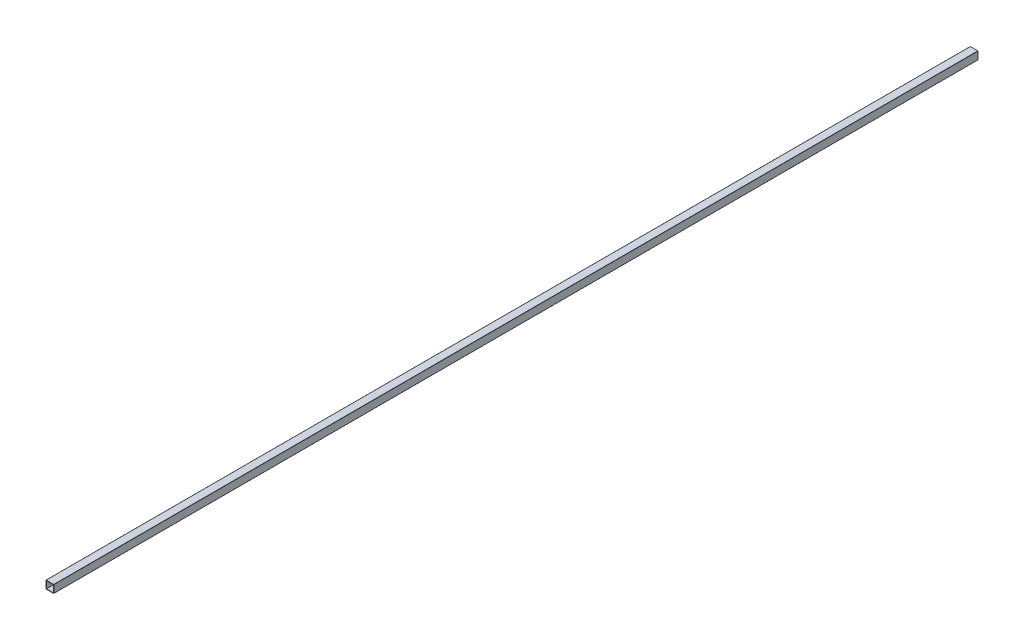
ISO-10303-21;
HEADER;
FILE_DESCRIPTION(('STEP AP214'),'2;1');
FILE_NAME('part.step','',(''),(''),'','','');
FILE_SCHEMA(('AUTOMOTIVE_DESIGN { 1 0 10303 214 1 1 1 1 }'));
ENDSEC;
DATA;
#1=APPLICATION_CONTEXT('core data for automotive mechanical design processes');
#2=APPLICATION_PROTOCOL_DEFINITION('international standard','automotive_design',2000,#1);
#3=PRODUCT_CONTEXT('',#1,'mechanical');
#4=PRODUCT('Part','Part','',(#3));
#5=PRODUCT_RELATED_PRODUCT_CATEGORY('part','',(#4));
#6=PRODUCT_DEFINITION_FORMATION('','',#4);
#7=PRODUCT_DEFINITION_CONTEXT('part definition',#1,'design');
#8=PRODUCT_DEFINITION('design','',#6,#7);
#9=PRODUCT_DEFINITION_SHAPE('','',#8);
#10=(LENGTH_UNIT() NAMED_UNIT(*) SI_UNIT(.MILLI.,.METRE.));
#11=(NAMED_UNIT(*) PLANE_ANGLE_UNIT() SI_UNIT($,.RADIAN.));
#12=(NAMED_UNIT(*) SI_UNIT($,.STERADIAN.) SOLID_ANGLE_UNIT());
#13=UNCERTAINTY_MEASURE_WITH_UNIT(LENGTH_MEASURE(1.E-05),#10,'distance_accuracy_value','');
#14=(GEOMETRIC_REPRESENTATION_CONTEXT(3) GLOBAL_UNCERTAINTY_ASSIGNED_CONTEXT((#13)) GLOBAL_UNIT_ASSIGNED_CONTEXT((#10,
#11,#12)) REPRESENTATION_CONTEXT('',''));
#15=CARTESIAN_POINT('',(0.,0.,0.));
#16=DIRECTION('',(0.,0.,1.));
#17=DIRECTION('',(1.,0.,0.));
#18=AXIS2_PLACEMENT_3D('',#15,#16,#17);
#19=CARTESIAN_POINT('',(24.4,24.4,6000.));
#20=DIRECTION('',(0.,0.,-1.));
#21=DIRECTION('',(-1.,0.,0.));
#22=AXIS2_PLACEMENT_3D('',#19,#20,#21);
#23=PLANE('',#22);
#24=CARTESIAN_POINT('',(24.4,24.4,6000.));
#25=DIRECTION('',(0.,0.,1.));
#26=DIRECTION('',(-1.,0.,0.));
#27=AXIS2_PLACEMENT_3D('',#24,#25,#26);
#28=CIRCLE('',#27,1.);
#29=CARTESIAN_POINT('',(25.4,24.4,6000.));
#30=VERTEX_POINT('',#29);
#31=CARTESIAN_POINT('',(24.4,25.4,6000.));
#32=VERTEX_POINT('',#31);
#33=EDGE_CURVE('E158',#30,#32,#28,.T.);
#34=ORIENTED_EDGE('',*,*,#33,.T.);
#35=DIRECTION('',(-1.,0.,0.));
#36=VECTOR('',#35,1.);
#37=CARTESIAN_POINT('',(-24.4,25.4,6000.));
#38=LINE('',#37,#36);
#39=CARTESIAN_POINT('',(-24.4,25.4,6000.));
#40=VERTEX_POINT('',#39);
#41=EDGE_CURVE('E161',#32,#40,#38,.T.);
#42=ORIENTED_EDGE('',*,*,#41,.T.);
#43=CARTESIAN_POINT('',(-24.4,24.4,6000.));
#44=DIRECTION('',(0.,0.,1.));
#45=DIRECTION('',(-1.,0.,0.));
#46=AXIS2_PLACEMENT_3D('',#43,#44,#45);
#47=CIRCLE('',#46,1.);
#48=CARTESIAN_POINT('',(-25.4,24.4,6000.));
#49=VERTEX_POINT('',#48);
#50=EDGE_CURVE('E164',#40,#49,#47,.T.);
#51=ORIENTED_EDGE('',*,*,#50,.T.);
#52=DIRECTION('',(0.,-1.,0.));
#53=VECTOR('',#52,1.);
#54=CARTESIAN_POINT('',(-25.4,-24.4,6000.));
#55=LINE('',#54,#53);
#56=CARTESIAN_POINT('',(-25.4,-24.4,6000.));
#57=VERTEX_POINT('',#56);
#58=EDGE_CURVE('E166',#49,#57,#55,.T.);
#59=ORIENTED_EDGE('',*,*,#58,.T.);
#60=CARTESIAN_POINT('',(-24.4,-24.4,6000.));
#61=DIRECTION('',(0.,0.,1.));
#62=DIRECTION('',(-1.,0.,0.));
#63=AXIS2_PLACEMENT_3D('',#60,#61,#62);
#64=CIRCLE('',#63,1.);
#65=CARTESIAN_POINT('',(-24.4,-25.4,6000.));
#66=VERTEX_POINT('',#65);
#67=EDGE_CURVE('E168',#57,#66,#64,.T.);
#68=ORIENTED_EDGE('',*,*,#67,.T.);
#69=DIRECTION('',(1.,0.,0.));
#70=VECTOR('',#69,1.);
#71=CARTESIAN_POINT('',(-24.4,-25.4,6000.));
#72=LINE('',#71,#70);
#73=CARTESIAN_POINT('',(24.4,-25.4,6000.));
#74=VERTEX_POINT('',#73);
#75=EDGE_CURVE('E170',#66,#74,#72,.T.);
#76=ORIENTED_EDGE('',*,*,#75,.T.);
#77=CARTESIAN_POINT('',(24.4,-24.4,6000.));
#78=DIRECTION('',(0.,0.,1.));
#79=DIRECTION('',(1.,0.,0.));
#80=AXIS2_PLACEMENT_3D('',#77,#78,#79);
#81=CIRCLE('',#80,1.);
#82=CARTESIAN_POINT('',(25.4,-24.4,6000.));
#83=VERTEX_POINT('',#82);
#84=EDGE_CURVE('E172',#74,#83,#81,.T.);
#85=ORIENTED_EDGE('',*,*,#84,.T.);
#86=DIRECTION('',(0.,1.,0.));
#87=VECTOR('',#86,1.);
#88=CARTESIAN_POINT('',(25.4,-24.4,6000.));
#89=LINE('',#88,#87);
#90=EDGE_CURVE('E174',#83,#30,#89,.T.);
#91=ORIENTED_EDGE('',*,*,#90,.T.);
#92=EDGE_LOOP('',(#34,#42,#51,#59,#68,#76,#85,#91));
#93=FACE_BOUND('',#92,.T.);
#94=DIRECTION('',(1.,0.,0.));
#95=VECTOR('',#94,1.);
#96=CARTESIAN_POINT('',(-22.74,-22.74,6000.));
#97=LINE('',#96,#95);
#98=CARTESIAN_POINT('',(-22.74,-22.74,6000.));
#99=VERTEX_POINT('',#98);
#100=CARTESIAN_POINT('',(22.74,-22.74,6000.));
#101=VERTEX_POINT('',#100);
#102=EDGE_CURVE('E122',#99,#101,#97,.T.);
#103=ORIENTED_EDGE('',*,*,#102,.F.);
#104=DIRECTION('',(0.,-1.,0.));
#105=VECTOR('',#104,1.);
#106=CARTESIAN_POINT('',(-22.74,-22.74,6000.));
#107=LINE('',#106,#105);
#108=CARTESIAN_POINT('',(-22.74,22.74,6000.));
#109=VERTEX_POINT('',#108);
#110=EDGE_CURVE('E144',#109,#99,#107,.T.);
#111=ORIENTED_EDGE('',*,*,#110,.F.);
#112=DIRECTION('',(-1.,0.,0.));
#113=VECTOR('',#112,1.);
#114=CARTESIAN_POINT('',(-22.74,22.74,6000.));
#115=LINE('',#114,#113);
#116=CARTESIAN_POINT('',(22.74,22.74,6000.));
#117=VERTEX_POINT('',#116);
#118=EDGE_CURVE('E142',#117,#109,#115,.T.);
#119=ORIENTED_EDGE('',*,*,#118,.F.);
#120=DIRECTION('',(0.,1.,0.));
#121=VECTOR('',#120,1.);
#122=CARTESIAN_POINT('',(22.74,-22.74,6000.));
#123=LINE('',#122,#121);
#124=EDGE_CURVE('E130',#101,#117,#123,.T.);
#125=ORIENTED_EDGE('',*,*,#124,.F.);
#126=EDGE_LOOP('',(#103,#111,#119,#125));
#127=FACE_BOUND('',#126,.T.);
#128=ADVANCED_FACE('F33',(#93,#127),#23,.F.);
#129=CARTESIAN_POINT('',(24.4,24.4,0.));
#130=DIRECTION('',(0.,0.,-1.));
#131=DIRECTION('',(-1.,0.,0.));
#132=AXIS2_PLACEMENT_3D('',#129,#130,#131);
#133=PLANE('',#132);
#134=CARTESIAN_POINT('',(24.4,24.4,0.));
#135=DIRECTION('',(0.,0.,1.));
#136=DIRECTION('',(-1.,0.,0.));
#137=AXIS2_PLACEMENT_3D('',#134,#135,#136);
#138=CIRCLE('',#137,1.);
#139=CARTESIAN_POINT('',(25.4,24.4,0.));
#140=VERTEX_POINT('',#139);
#141=CARTESIAN_POINT('',(24.4,25.4,0.));
#142=VERTEX_POINT('',#141);
#143=EDGE_CURVE('E138',#140,#142,#138,.T.);
#144=ORIENTED_EDGE('',*,*,#143,.F.);
#145=DIRECTION('',(0.,1.,0.));
#146=VECTOR('',#145,1.);
#147=CARTESIAN_POINT('',(25.4,-24.4,0.));
#148=LINE('',#147,#146);
#149=CARTESIAN_POINT('',(25.4,-24.4,0.));
#150=VERTEX_POINT('',#149);
#151=EDGE_CURVE('E162',#150,#140,#148,.T.);
#152=ORIENTED_EDGE('',*,*,#151,.F.);
#153=CARTESIAN_POINT('',(24.4,-24.4,0.));
#154=DIRECTION('',(0.,0.,1.));
#155=DIRECTION('',(1.,0.,0.));
#156=AXIS2_PLACEMENT_3D('',#153,#154,#155);
#157=CIRCLE('',#156,1.);
#158=CARTESIAN_POINT('',(24.4,-25.4,0.));
#159=VERTEX_POINT('',#158);
#160=EDGE_CURVE('E189',#159,#150,#157,.T.);
#161=ORIENTED_EDGE('',*,*,#160,.F.);
#162=DIRECTION('',(1.,0.,0.));
#163=VECTOR('',#162,1.);
#164=CARTESIAN_POINT('',(-24.4,-25.4,0.));
#165=LINE('',#164,#163);
#166=CARTESIAN_POINT('',(-24.4,-25.4,0.));
#167=VERTEX_POINT('',#166);
#168=EDGE_CURVE('E187',#167,#159,#165,.T.);
#169=ORIENTED_EDGE('',*,*,#168,.F.);
#170=CARTESIAN_POINT('',(-24.4,-24.4,0.));
#171=DIRECTION('',(0.,0.,1.));
#172=DIRECTION('',(-1.,0.,0.));
#173=AXIS2_PLACEMENT_3D('',#170,#171,#172);
#174=CIRCLE('',#173,1.);
#175=CARTESIAN_POINT('',(-25.4,-24.4,0.));
#176=VERTEX_POINT('',#175);
#177=EDGE_CURVE('E185',#176,#167,#174,.T.);
#178=ORIENTED_EDGE('',*,*,#177,.F.);
#179=DIRECTION('',(0.,-1.,0.));
#180=VECTOR('',#179,1.);
#181=CARTESIAN_POINT('',(-25.4,-24.4,0.));
#182=LINE('',#181,#180);
#183=CARTESIAN_POINT('',(-25.4,24.4,0.));
#184=VERTEX_POINT('',#183);
#185=EDGE_CURVE('E183',#184,#176,#182,.T.);
#186=ORIENTED_EDGE('',*,*,#185,.F.);
#187=CARTESIAN_POINT('',(-24.4,24.4,0.));
#188=DIRECTION('',(0.,0.,1.));
#189=DIRECTION('',(-1.,0.,0.));
#190=AXIS2_PLACEMENT_3D('',#187,#188,#189);
#191=CIRCLE('',#190,1.);
#192=CARTESIAN_POINT('',(-24.4,25.4,0.));
#193=VERTEX_POINT('',#192);
#194=EDGE_CURVE('E181',#193,#184,#191,.T.);
#195=ORIENTED_EDGE('',*,*,#194,.F.);
#196=DIRECTION('',(-1.,0.,0.));
#197=VECTOR('',#196,1.);
#198=CARTESIAN_POINT('',(-24.4,25.4,0.));
#199=LINE('',#198,#197);
#200=EDGE_CURVE('E179',#142,#193,#199,.T.);
#201=ORIENTED_EDGE('',*,*,#200,.F.);
#202=EDGE_LOOP('',(#144,#152,#161,#169,#178,#186,#195,#201));
#203=FACE_BOUND('',#202,.T.);
#204=DIRECTION('',(0.,-1.,0.));
#205=VECTOR('',#204,1.);
#206=CARTESIAN_POINT('',(-22.74,-22.74,0.));
#207=LINE('',#206,#205);
#208=CARTESIAN_POINT('',(-22.74,22.74,0.));
#209=VERTEX_POINT('',#208);
#210=CARTESIAN_POINT('',(-22.74,-22.74,0.));
#211=VERTEX_POINT('',#210);
#212=EDGE_CURVE('E131',#209,#211,#207,.T.);
#213=ORIENTED_EDGE('',*,*,#212,.T.);
#214=DIRECTION('',(1.,0.,0.));
#215=VECTOR('',#214,1.);
#216=CARTESIAN_POINT('',(-22.74,-22.74,0.));
#217=LINE('',#216,#215);
#218=CARTESIAN_POINT('',(22.74,-22.74,0.));
#219=VERTEX_POINT('',#218);
#220=EDGE_CURVE('E56',#211,#219,#217,.T.);
#221=ORIENTED_EDGE('',*,*,#220,.T.);
#222=DIRECTION('',(0.,1.,0.));
#223=VECTOR('',#222,1.);
#224=CARTESIAN_POINT('',(22.74,-22.74,0.));
#225=LINE('',#224,#223);
#226=CARTESIAN_POINT('',(22.74,22.74,0.));
#227=VERTEX_POINT('',#226);
#228=EDGE_CURVE('E137',#219,#227,#225,.T.);
#229=ORIENTED_EDGE('',*,*,#228,.T.);
#230=DIRECTION('',(-1.,0.,0.));
#231=VECTOR('',#230,1.);
#232=CARTESIAN_POINT('',(-22.74,22.74,0.));
#233=LINE('',#232,#231);
#234=EDGE_CURVE('E150',#227,#209,#233,.T.);
#235=ORIENTED_EDGE('',*,*,#234,.T.);
#236=EDGE_LOOP('',(#213,#221,#229,#235));
#237=FACE_BOUND('',#236,.T.);
#238=ADVANCED_FACE('F219',(#203,#237),#133,.T.);
#239=CARTESIAN_POINT('',(24.4,24.4,6000.));
#240=DIRECTION('',(0.,0.,-1.));
#241=DIRECTION('',(-1.,0.,0.));
#242=AXIS2_PLACEMENT_3D('',#239,#240,#241);
#243=CYLINDRICAL_SURFACE('',#242,1.);
#244=ORIENTED_EDGE('',*,*,#143,.T.);
#245=DIRECTION('',(0.,0.,-1.));
#246=VECTOR('',#245,1.);
#247=CARTESIAN_POINT('',(24.4,25.4,6000.));
#248=LINE('',#247,#246);
#249=EDGE_CURVE('E11',#32,#142,#248,.T.);
#250=ORIENTED_EDGE('',*,*,#249,.F.);
#251=ORIENTED_EDGE('',*,*,#33,.F.);
#252=DIRECTION('',(0.,0.,-1.));
#253=VECTOR('',#252,1.);
#254=CARTESIAN_POINT('',(25.4,24.4,6000.));
#255=LINE('',#254,#253);
#256=EDGE_CURVE('E176',#30,#140,#255,.T.);
#257=ORIENTED_EDGE('',*,*,#256,.T.);
#258=EDGE_LOOP('',(#244,#250,#251,#257));
#259=FACE_BOUND('',#258,.T.);
#260=ADVANCED_FACE('F35',(#259),#243,.T.);
#261=CARTESIAN_POINT('',(-24.4,25.4,6000.));
#262=DIRECTION('',(0.,-1.,0.));
#263=DIRECTION('',(0.,0.,-1.));
#264=AXIS2_PLACEMENT_3D('',#261,#262,#263);
#265=PLANE('',#264);
#266=ORIENTED_EDGE('',*,*,#200,.T.);
#267=DIRECTION('',(0.,0.,-1.));
#268=VECTOR('',#267,1.);
#269=CARTESIAN_POINT('',(-24.4,25.4,6000.));
#270=LINE('',#269,#268);
#271=EDGE_CURVE('E41',#40,#193,#270,.T.);
#272=ORIENTED_EDGE('',*,*,#271,.F.);
#273=ORIENTED_EDGE('',*,*,#41,.F.);
#274=ORIENTED_EDGE('',*,*,#249,.T.);
#275=EDGE_LOOP('',(#266,#272,#273,#274));
#276=FACE_BOUND('',#275,.T.);
#277=ADVANCED_FACE('F236',(#276),#265,.F.);
#278=CARTESIAN_POINT('',(-24.4,24.4,6000.));
#279=DIRECTION('',(0.,0.,-1.));
#280=DIRECTION('',(-1.,0.,0.));
#281=AXIS2_PLACEMENT_3D('',#278,#279,#280);
#282=CYLINDRICAL_SURFACE('',#281,1.);
#283=ORIENTED_EDGE('',*,*,#194,.T.);
#284=DIRECTION('',(0.,0.,-1.));
#285=VECTOR('',#284,1.);
#286=CARTESIAN_POINT('',(-25.4,24.4,6000.));
#287=LINE('',#286,#285);
#288=EDGE_CURVE('E206',#49,#184,#287,.T.);
#289=ORIENTED_EDGE('',*,*,#288,.F.);
#290=ORIENTED_EDGE('',*,*,#50,.F.);
#291=ORIENTED_EDGE('',*,*,#271,.T.);
#292=EDGE_LOOP('',(#283,#289,#290,#291));
#293=FACE_BOUND('',#292,.T.);
#294=ADVANCED_FACE('F213',(#293),#282,.T.);
#295=CARTESIAN_POINT('',(-25.4,-24.4,6000.));
#296=DIRECTION('',(1.,0.,0.));
#297=DIRECTION('',(0.,0.,-1.));
#298=AXIS2_PLACEMENT_3D('',#295,#296,#297);
#299=PLANE('',#298);
#300=ORIENTED_EDGE('',*,*,#185,.T.);
#301=DIRECTION('',(0.,0.,-1.));
#302=VECTOR('',#301,1.);
#303=CARTESIAN_POINT('',(-25.4,-24.4,6000.));
#304=LINE('',#303,#302);
#305=EDGE_CURVE('E203',#57,#176,#304,.T.);
#306=ORIENTED_EDGE('',*,*,#305,.F.);
#307=ORIENTED_EDGE('',*,*,#58,.F.);
#308=ORIENTED_EDGE('',*,*,#288,.T.);
#309=EDGE_LOOP('',(#300,#306,#307,#308));
#310=FACE_BOUND('',#309,.T.);
#311=ADVANCED_FACE('F225',(#310),#299,.F.);
#312=CARTESIAN_POINT('',(-24.4,-24.4,6000.));
#313=DIRECTION('',(0.,0.,-1.));
#314=DIRECTION('',(-1.,0.,0.));
#315=AXIS2_PLACEMENT_3D('',#312,#313,#314);
#316=CYLINDRICAL_SURFACE('',#315,1.);
#317=ORIENTED_EDGE('',*,*,#177,.T.);
#318=DIRECTION('',(0.,0.,-1.));
#319=VECTOR('',#318,1.);
#320=CARTESIAN_POINT('',(-24.4,-25.4,6000.));
#321=LINE('',#320,#319);
#322=EDGE_CURVE('E200',#66,#167,#321,.T.);
#323=ORIENTED_EDGE('',*,*,#322,.F.);
#324=ORIENTED_EDGE('',*,*,#67,.F.);
#325=ORIENTED_EDGE('',*,*,#305,.T.);
#326=EDGE_LOOP('',(#317,#323,#324,#325));
#327=FACE_BOUND('',#326,.T.);
#328=ADVANCED_FACE('F229',(#327),#316,.T.);
#329=CARTESIAN_POINT('',(-24.4,-25.4,6000.));
#330=DIRECTION('',(0.,1.,0.));
#331=DIRECTION('',(0.,0.,1.));
#332=AXIS2_PLACEMENT_3D('',#329,#330,#331);
#333=PLANE('',#332);
#334=ORIENTED_EDGE('',*,*,#168,.T.);
#335=DIRECTION('',(0.,0.,-1.));
#336=VECTOR('',#335,1.);
#337=CARTESIAN_POINT('',(24.4,-25.4,6000.));
#338=LINE('',#337,#336);
#339=EDGE_CURVE('E197',#74,#159,#338,.T.);
#340=ORIENTED_EDGE('',*,*,#339,.F.);
#341=ORIENTED_EDGE('',*,*,#75,.F.);
#342=ORIENTED_EDGE('',*,*,#322,.T.);
#343=EDGE_LOOP('',(#334,#340,#341,#342));
#344=FACE_BOUND('',#343,.T.);
#345=ADVANCED_FACE('F249',(#344),#333,.F.);
#346=CARTESIAN_POINT('',(24.4,-24.4,6000.));
#347=DIRECTION('',(0.,0.,-1.));
#348=DIRECTION('',(-1.,0.,0.));
#349=AXIS2_PLACEMENT_3D('',#346,#347,#348);
#350=CYLINDRICAL_SURFACE('',#349,1.);
#351=ORIENTED_EDGE('',*,*,#160,.T.);
#352=DIRECTION('',(0.,0.,-1.));
#353=VECTOR('',#352,1.);
#354=CARTESIAN_POINT('',(25.4,-24.4,6000.));
#355=LINE('',#354,#353);
#356=EDGE_CURVE('E194',#83,#150,#355,.T.);
#357=ORIENTED_EDGE('',*,*,#356,.F.);
#358=ORIENTED_EDGE('',*,*,#84,.F.);
#359=ORIENTED_EDGE('',*,*,#339,.T.);
#360=EDGE_LOOP('',(#351,#357,#358,#359));
#361=FACE_BOUND('',#360,.T.);
#362=ADVANCED_FACE('F247',(#361),#350,.T.);
#363=CARTESIAN_POINT('',(25.4,-24.4,6000.));
#364=DIRECTION('',(-1.,0.,0.));
#365=DIRECTION('',(0.,0.,1.));
#366=AXIS2_PLACEMENT_3D('',#363,#364,#365);
#367=PLANE('',#366);
#368=ORIENTED_EDGE('',*,*,#151,.T.);
#369=ORIENTED_EDGE('',*,*,#256,.F.);
#370=ORIENTED_EDGE('',*,*,#90,.F.);
#371=ORIENTED_EDGE('',*,*,#356,.T.);
#372=EDGE_LOOP('',(#368,#369,#370,#371));
#373=FACE_BOUND('',#372,.T.);
#374=ADVANCED_FACE('F242',(#373),#367,.F.);
#375=CARTESIAN_POINT('',(-22.74,-22.74,6000.));
#376=DIRECTION('',(0.,1.,0.));
#377=DIRECTION('',(0.,0.,1.));
#378=AXIS2_PLACEMENT_3D('',#375,#376,#377);
#379=PLANE('',#378);
#380=ORIENTED_EDGE('',*,*,#220,.F.);
#381=DIRECTION('',(0.,0.,-1.));
#382=VECTOR('',#381,1.);
#383=CARTESIAN_POINT('',(-22.74,-22.74,6000.));
#384=LINE('',#383,#382);
#385=EDGE_CURVE('E126',#99,#211,#384,.T.);
#386=ORIENTED_EDGE('',*,*,#385,.F.);
#387=ORIENTED_EDGE('',*,*,#102,.T.);
#388=DIRECTION('',(0.,0.,-1.));
#389=VECTOR('',#388,1.);
#390=CARTESIAN_POINT('',(22.74,-22.74,6000.));
#391=LINE('',#390,#389);
#392=EDGE_CURVE('E125',#101,#219,#391,.T.);
#393=ORIENTED_EDGE('',*,*,#392,.T.);
#394=EDGE_LOOP('',(#380,#386,#387,#393));
#395=FACE_BOUND('',#394,.T.);
#396=ADVANCED_FACE('F124',(#395),#379,.T.);
#397=CARTESIAN_POINT('',(22.74,-22.74,6000.));
#398=DIRECTION('',(-1.,0.,0.));
#399=DIRECTION('',(0.,-1.,0.));
#400=AXIS2_PLACEMENT_3D('',#397,#398,#399);
#401=PLANE('',#400);
#402=ORIENTED_EDGE('',*,*,#228,.F.);
#403=ORIENTED_EDGE('',*,*,#392,.F.);
#404=ORIENTED_EDGE('',*,*,#124,.T.);
#405=DIRECTION('',(0.,0.,-1.));
#406=VECTOR('',#405,1.);
#407=CARTESIAN_POINT('',(22.74,22.74,6000.));
#408=LINE('',#407,#406);
#409=EDGE_CURVE('E139',#117,#227,#408,.T.);
#410=ORIENTED_EDGE('',*,*,#409,.T.);
#411=EDGE_LOOP('',(#402,#403,#404,#410));
#412=FACE_BOUND('',#411,.T.);
#413=ADVANCED_FACE('F134',(#412),#401,.T.);
#414=CARTESIAN_POINT('',(-22.74,22.74,6000.));
#415=DIRECTION('',(0.,-1.,0.));
#416=DIRECTION('',(1.,0.,0.));
#417=AXIS2_PLACEMENT_3D('',#414,#415,#416);
#418=PLANE('',#417);
#419=ORIENTED_EDGE('',*,*,#234,.F.);
#420=ORIENTED_EDGE('',*,*,#409,.F.);
#421=ORIENTED_EDGE('',*,*,#118,.T.);
#422=DIRECTION('',(0.,0.,-1.));
#423=VECTOR('',#422,1.);
#424=CARTESIAN_POINT('',(-22.74,22.74,6000.));
#425=LINE('',#424,#423);
#426=EDGE_CURVE('E48',#109,#209,#425,.T.);
#427=ORIENTED_EDGE('',*,*,#426,.T.);
#428=EDGE_LOOP('',(#419,#420,#421,#427));
#429=FACE_BOUND('',#428,.T.);
#430=ADVANCED_FACE('F274',(#429),#418,.T.);
#431=CARTESIAN_POINT('',(-22.74,-22.74,6000.));
#432=DIRECTION('',(1.,0.,0.));
#433=DIRECTION('',(0.,0.,-1.));
#434=AXIS2_PLACEMENT_3D('',#431,#432,#433);
#435=PLANE('',#434);
#436=ORIENTED_EDGE('',*,*,#212,.F.);
#437=ORIENTED_EDGE('',*,*,#426,.F.);
#438=ORIENTED_EDGE('',*,*,#110,.T.);
#439=ORIENTED_EDGE('',*,*,#385,.T.);
#440=EDGE_LOOP('',(#436,#437,#438,#439));
#441=FACE_BOUND('',#440,.T.);
#442=ADVANCED_FACE('F278',(#441),#435,.T.);
#443=CLOSED_SHELL('',(#128,#238,#260,#277,#294,#311,#328,#345,#362,#374,#396,#413,#430,#442));
#444=MANIFOLD_SOLID_BREP('B2',#443);
#445=ADVANCED_BREP_SHAPE_REPRESENTATION('',(#18,#444),#14);
#446=SHAPE_DEFINITION_REPRESENTATION(#9,#445);
ENDSEC;
END-ISO-10303-21;
